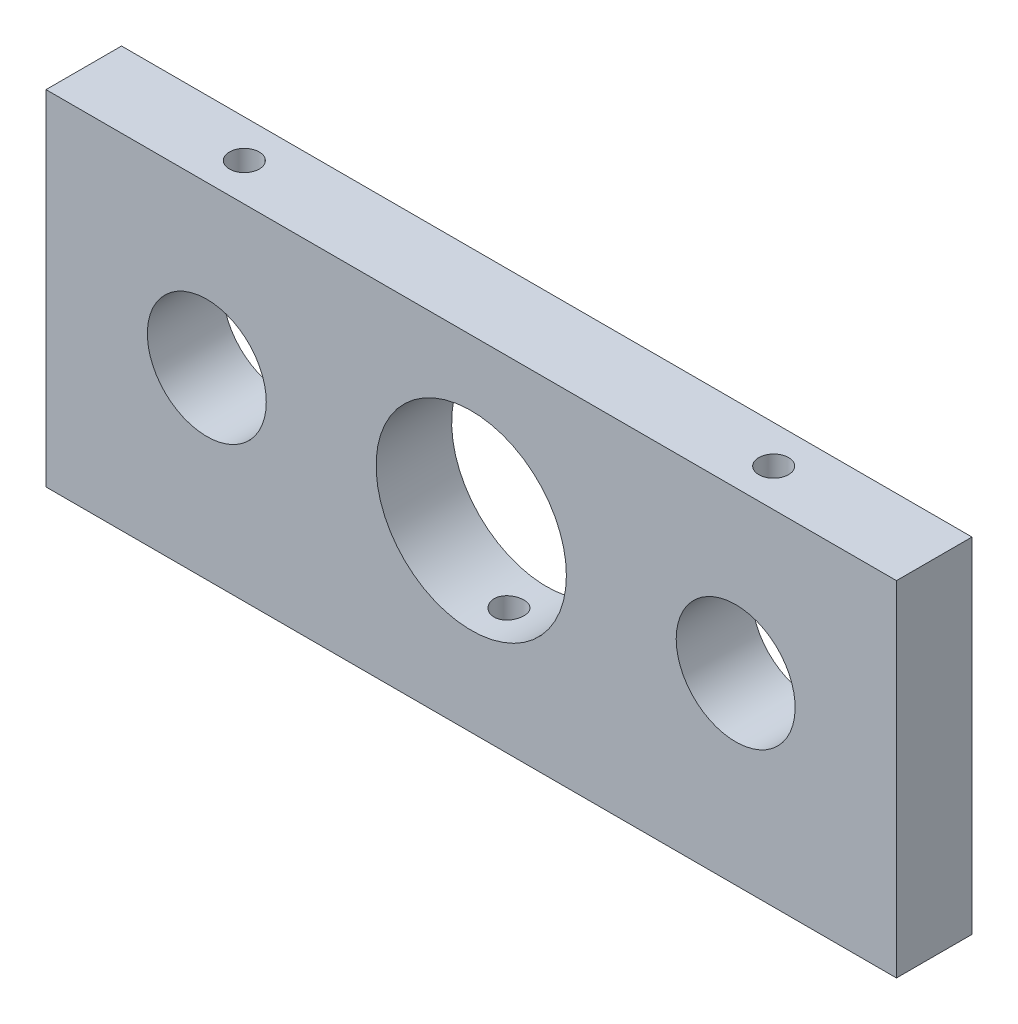
ISO-10303-21;
HEADER;
FILE_DESCRIPTION(('STEP AP214'),'2;1');
FILE_NAME('part.step','',(''),(''),'','','');
FILE_SCHEMA(('AUTOMOTIVE_DESIGN { 1 0 10303 214 1 1 1 1 }'));
ENDSEC;
DATA;
#1=APPLICATION_CONTEXT('core data for automotive mechanical design processes');
#2=APPLICATION_PROTOCOL_DEFINITION('international standard','automotive_design',2000,#1);
#3=PRODUCT_CONTEXT('',#1,'mechanical');
#4=PRODUCT('Part','Part','',(#3));
#5=PRODUCT_RELATED_PRODUCT_CATEGORY('part','',(#4));
#6=PRODUCT_DEFINITION_FORMATION('','',#4);
#7=PRODUCT_DEFINITION_CONTEXT('part definition',#1,'design');
#8=PRODUCT_DEFINITION('design','',#6,#7);
#9=PRODUCT_DEFINITION_SHAPE('','',#8);
#10=(LENGTH_UNIT() NAMED_UNIT(*) SI_UNIT(.MILLI.,.METRE.));
#11=(NAMED_UNIT(*) PLANE_ANGLE_UNIT() SI_UNIT($,.RADIAN.));
#12=(NAMED_UNIT(*) SI_UNIT($,.STERADIAN.) SOLID_ANGLE_UNIT());
#13=UNCERTAINTY_MEASURE_WITH_UNIT(LENGTH_MEASURE(1.E-05),#10,'distance_accuracy_value','');
#14=(GEOMETRIC_REPRESENTATION_CONTEXT(3) GLOBAL_UNCERTAINTY_ASSIGNED_CONTEXT((#13)) GLOBAL_UNIT_ASSIGNED_CONTEXT((#10,
#11,#12)) REPRESENTATION_CONTEXT('',''));
#15=CARTESIAN_POINT('',(0.,0.,0.));
#16=DIRECTION('',(0.,0.,1.));
#17=DIRECTION('',(1.,0.,0.));
#18=AXIS2_PLACEMENT_3D('',#15,#16,#17);
#19=CARTESIAN_POINT('',(-71.505,27.,10.));
#20=DIRECTION('',(1.,0.,0.));
#21=DIRECTION('',(0.,0.,-1.));
#22=AXIS2_PLACEMENT_3D('',#19,#20,#21);
#23=PLANE('',#22);
#24=DIRECTION('',(0.,0.,-1.));
#25=VECTOR('',#24,1.);
#26=CARTESIAN_POINT('',(-71.505,27.,10.));
#27=LINE('',#26,#25);
#28=CARTESIAN_POINT('',(-71.505,27.,10.));
#29=VERTEX_POINT('',#28);
#30=CARTESIAN_POINT('',(-71.505,27.,-2.7));
#31=VERTEX_POINT('',#30);
#32=EDGE_CURVE('E42',#29,#31,#27,.T.);
#33=ORIENTED_EDGE('',*,*,#32,.T.);
#34=DIRECTION('',(0.,-1.,0.));
#35=VECTOR('',#34,1.);
#36=CARTESIAN_POINT('',(-71.505,27.,-2.7));
#37=LINE('',#36,#35);
#38=CARTESIAN_POINT('',(-71.505,-30.87,-2.69999999999999));
#39=VERTEX_POINT('',#38);
#40=EDGE_CURVE('E84',#31,#39,#37,.T.);
#41=ORIENTED_EDGE('',*,*,#40,.T.);
#42=DIRECTION('',(0.,0.,1.));
#43=VECTOR('',#42,1.);
#44=CARTESIAN_POINT('',(-71.505,-30.87,0.));
#45=LINE('',#44,#43);
#46=CARTESIAN_POINT('',(-71.505,-30.87,10.));
#47=VERTEX_POINT('',#46);
#48=EDGE_CURVE('E82',#39,#47,#45,.T.);
#49=ORIENTED_EDGE('',*,*,#48,.T.);
#50=DIRECTION('',(0.,-1.,0.));
#51=VECTOR('',#50,1.);
#52=CARTESIAN_POINT('',(-71.505,27.,10.));
#53=LINE('',#52,#51);
#54=EDGE_CURVE('E72',#29,#47,#53,.T.);
#55=ORIENTED_EDGE('',*,*,#54,.F.);
#56=EDGE_LOOP('',(#33,#41,#49,#55));
#57=FACE_BOUND('',#56,.T.);
#58=ADVANCED_FACE('F30',(#57),#23,.F.);
#59=CARTESIAN_POINT('',(71.505,27.,10.));
#60=DIRECTION('',(-1.,0.,0.));
#61=DIRECTION('',(0.,0.,1.));
#62=AXIS2_PLACEMENT_3D('',#59,#60,#61);
#63=PLANE('',#62);
#64=DIRECTION('',(0.,1.,0.));
#65=VECTOR('',#64,1.);
#66=CARTESIAN_POINT('',(71.505,27.,10.));
#67=LINE('',#66,#65);
#68=CARTESIAN_POINT('',(71.505,-30.87,10.));
#69=VERTEX_POINT('',#68);
#70=CARTESIAN_POINT('',(71.505,27.,10.));
#71=VERTEX_POINT('',#70);
#72=EDGE_CURVE('E55',#69,#71,#67,.T.);
#73=ORIENTED_EDGE('',*,*,#72,.F.);
#74=DIRECTION('',(0.,0.,-1.));
#75=VECTOR('',#74,1.);
#76=CARTESIAN_POINT('',(71.505,-30.87,0.));
#77=LINE('',#76,#75);
#78=CARTESIAN_POINT('',(71.505,-30.87,-2.69999999999999));
#79=VERTEX_POINT('',#78);
#80=EDGE_CURVE('E78',#69,#79,#77,.T.);
#81=ORIENTED_EDGE('',*,*,#80,.T.);
#82=DIRECTION('',(0.,1.,0.));
#83=VECTOR('',#82,1.);
#84=CARTESIAN_POINT('',(71.505,27.,-2.7));
#85=LINE('',#84,#83);
#86=CARTESIAN_POINT('',(71.505,27.,-2.7));
#87=VERTEX_POINT('',#86);
#88=EDGE_CURVE('E110',#79,#87,#85,.T.);
#89=ORIENTED_EDGE('',*,*,#88,.T.);
#90=DIRECTION('',(0.,0.,-1.));
#91=VECTOR('',#90,1.);
#92=CARTESIAN_POINT('',(71.505,27.,10.));
#93=LINE('',#92,#91);
#94=EDGE_CURVE('E11',#71,#87,#93,.T.);
#95=ORIENTED_EDGE('',*,*,#94,.F.);
#96=EDGE_LOOP('',(#73,#81,#89,#95));
#97=FACE_BOUND('',#96,.T.);
#98=ADVANCED_FACE('F143',(#97),#63,.F.);
#99=CARTESIAN_POINT('',(-71.505,27.,10.));
#100=DIRECTION('',(0.,-1.,0.));
#101=DIRECTION('',(0.,0.,-1.));
#102=AXIS2_PLACEMENT_3D('',#99,#100,#101);
#103=PLANE('',#102);
#104=CARTESIAN_POINT('',(44.505,27.,3.65));
#105=DIRECTION('',(0.,1.,0.));
#106=DIRECTION('',(0.,0.,1.));
#107=AXIS2_PLACEMENT_3D('',#104,#105,#106);
#108=CIRCLE('',#107,2.5);
#109=CARTESIAN_POINT('',(44.505,27.,6.15000000000001));
#110=VERTEX_POINT('',#109);
#111=EDGE_CURVE('E342',#110,#110,#108,.T.);
#112=ORIENTED_EDGE('',*,*,#111,.F.);
#113=EDGE_LOOP('',(#112));
#114=FACE_BOUND('',#113,.T.);
#115=CARTESIAN_POINT('',(-44.505,27.,3.65000000000001));
#116=DIRECTION('',(0.,1.,0.));
#117=DIRECTION('',(0.,0.,1.));
#118=AXIS2_PLACEMENT_3D('',#115,#116,#117);
#119=CIRCLE('',#118,2.5);
#120=CARTESIAN_POINT('',(-44.505,27.,6.15000000000002));
#121=VERTEX_POINT('',#120);
#122=EDGE_CURVE('E349',#121,#121,#119,.T.);
#123=ORIENTED_EDGE('',*,*,#122,.F.);
#124=EDGE_LOOP('',(#123));
#125=FACE_BOUND('',#124,.T.);
#126=ORIENTED_EDGE('',*,*,#94,.T.);
#127=DIRECTION('',(-1.,0.,0.));
#128=VECTOR('',#127,1.);
#129=CARTESIAN_POINT('',(129.437951763224,27.,-2.7));
#130=LINE('',#129,#128);
#131=EDGE_CURVE('E87',#87,#31,#130,.T.);
#132=ORIENTED_EDGE('',*,*,#131,.T.);
#133=ORIENTED_EDGE('',*,*,#32,.F.);
#134=DIRECTION('',(-1.,0.,0.));
#135=VECTOR('',#134,1.);
#136=CARTESIAN_POINT('',(-71.505,27.,10.));
#137=LINE('',#136,#135);
#138=EDGE_CURVE('E50',#71,#29,#137,.T.);
#139=ORIENTED_EDGE('',*,*,#138,.F.);
#140=EDGE_LOOP('',(#126,#132,#133,#139));
#141=FACE_BOUND('',#140,.T.);
#142=ADVANCED_FACE('F145',(#114,#125,#141),#103,.F.);
#143=CARTESIAN_POINT('',(-71.505,-27.,10.));
#144=DIRECTION('',(0.,0.,1.));
#145=DIRECTION('',(1.,0.,0.));
#146=AXIS2_PLACEMENT_3D('',#143,#144,#145);
#147=PLANE('',#146);
#148=CARTESIAN_POINT('',(44.4650000000001,4.54497550705923E-13,10.));
#149=DIRECTION('',(0.,0.,1.));
#150=DIRECTION('',(-1.,0.,0.));
#151=AXIS2_PLACEMENT_3D('',#148,#149,#150);
#152=CIRCLE('',#151,9.99999999999993);
#153=CARTESIAN_POINT('',(34.4650000000002,4.54497550705923E-13,10.));
#154=VERTEX_POINT('',#153);
#155=EDGE_CURVE('E91',#154,#154,#152,.T.);
#156=ORIENTED_EDGE('',*,*,#155,.F.);
#157=EDGE_LOOP('',(#156));
#158=FACE_BOUND('',#157,.T.);
#159=CARTESIAN_POINT('',(-44.4650000000001,4.54497550705923E-13,10.));
#160=DIRECTION('',(0.,0.,1.));
#161=DIRECTION('',(1.,0.,0.));
#162=AXIS2_PLACEMENT_3D('',#159,#160,#161);
#163=CIRCLE('',#162,9.99999999999993);
#164=CARTESIAN_POINT('',(-34.4650000000002,4.54497550705923E-13,10.));
#165=VERTEX_POINT('',#164);
#166=EDGE_CURVE('E102',#165,#165,#163,.T.);
#167=ORIENTED_EDGE('',*,*,#166,.F.);
#168=EDGE_LOOP('',(#167));
#169=FACE_BOUND('',#168,.T.);
#170=CARTESIAN_POINT('',(0.,0.,10.));
#171=DIRECTION('',(0.,0.,1.));
#172=DIRECTION('',(1.,0.,0.));
#173=AXIS2_PLACEMENT_3D('',#170,#171,#172);
#174=CIRCLE('',#173,16.);
#175=CARTESIAN_POINT('',(16.,0.,10.));
#176=VERTEX_POINT('',#175);
#177=EDGE_CURVE('E106',#176,#176,#174,.T.);
#178=ORIENTED_EDGE('',*,*,#177,.F.);
#179=EDGE_LOOP('',(#178));
#180=FACE_BOUND('',#179,.T.);
#181=ORIENTED_EDGE('',*,*,#54,.T.);
#182=DIRECTION('',(1.,0.,0.));
#183=VECTOR('',#182,1.);
#184=CARTESIAN_POINT('',(-71.505,-30.87,10.));
#185=LINE('',#184,#183);
#186=EDGE_CURVE('E76',#47,#69,#185,.T.);
#187=ORIENTED_EDGE('',*,*,#186,.T.);
#188=ORIENTED_EDGE('',*,*,#72,.T.);
#189=ORIENTED_EDGE('',*,*,#138,.T.);
#190=EDGE_LOOP('',(#181,#187,#188,#189));
#191=FACE_BOUND('',#190,.T.);
#192=ADVANCED_FACE('F74',(#158,#169,#180,#191),#147,.T.);
#193=CARTESIAN_POINT('',(129.437951763224,-30.87,0.));
#194=DIRECTION('',(0.,-1.,0.));
#195=DIRECTION('',(0.,0.,-1.));
#196=AXIS2_PLACEMENT_3D('',#193,#194,#195);
#197=PLANE('',#196);
#198=CARTESIAN_POINT('',(33.505,-30.87,3.65000000000001));
#199=DIRECTION('',(0.,-1.,0.));
#200=DIRECTION('',(0.,0.,1.));
#201=AXIS2_PLACEMENT_3D('',#198,#199,#200);
#202=CIRCLE('',#201,2.5);
#203=CARTESIAN_POINT('',(33.505,-30.87,6.15000000000001));
#204=VERTEX_POINT('',#203);
#205=EDGE_CURVE('E355',#204,#204,#202,.T.);
#206=ORIENTED_EDGE('',*,*,#205,.F.);
#207=EDGE_LOOP('',(#206));
#208=FACE_BOUND('',#207,.T.);
#209=CARTESIAN_POINT('',(61.505,-30.87,3.65000000000002));
#210=DIRECTION('',(0.,-1.,0.));
#211=DIRECTION('',(0.,0.,1.));
#212=AXIS2_PLACEMENT_3D('',#209,#210,#211);
#213=CIRCLE('',#212,2.5);
#214=CARTESIAN_POINT('',(61.505,-30.87,6.15000000000002));
#215=VERTEX_POINT('',#214);
#216=EDGE_CURVE('E359',#215,#215,#213,.T.);
#217=ORIENTED_EDGE('',*,*,#216,.F.);
#218=EDGE_LOOP('',(#217));
#219=FACE_BOUND('',#218,.T.);
#220=CARTESIAN_POINT('',(-33.505,-30.87,3.65));
#221=DIRECTION('',(0.,-1.,0.));
#222=DIRECTION('',(0.,0.,-1.));
#223=AXIS2_PLACEMENT_3D('',#220,#221,#222);
#224=CIRCLE('',#223,2.5);
#225=CARTESIAN_POINT('',(-33.505,-30.87,1.15));
#226=VERTEX_POINT('',#225);
#227=EDGE_CURVE('E365',#226,#226,#224,.T.);
#228=ORIENTED_EDGE('',*,*,#227,.F.);
#229=EDGE_LOOP('',(#228));
#230=FACE_BOUND('',#229,.T.);
#231=CARTESIAN_POINT('',(0.,-30.87,3.65));
#232=DIRECTION('',(0.,-1.,0.));
#233=DIRECTION('',(0.,0.,-1.));
#234=AXIS2_PLACEMENT_3D('',#231,#232,#233);
#235=CIRCLE('',#234,2.5);
#236=CARTESIAN_POINT('',(0.,-30.87,1.15));
#237=VERTEX_POINT('',#236);
#238=EDGE_CURVE('E371',#237,#237,#235,.T.);
#239=ORIENTED_EDGE('',*,*,#238,.F.);
#240=EDGE_LOOP('',(#239));
#241=FACE_BOUND('',#240,.T.);
#242=CARTESIAN_POINT('',(-61.505,-30.87,3.65));
#243=DIRECTION('',(0.,-1.,0.));
#244=DIRECTION('',(0.,0.,-1.));
#245=AXIS2_PLACEMENT_3D('',#242,#243,#244);
#246=CIRCLE('',#245,2.5);
#247=CARTESIAN_POINT('',(-61.505,-30.87,1.15));
#248=VERTEX_POINT('',#247);
#249=EDGE_CURVE('E98',#248,#248,#246,.T.);
#250=ORIENTED_EDGE('',*,*,#249,.F.);
#251=EDGE_LOOP('',(#250));
#252=FACE_BOUND('',#251,.T.);
#253=ORIENTED_EDGE('',*,*,#80,.F.);
#254=ORIENTED_EDGE('',*,*,#186,.F.);
#255=ORIENTED_EDGE('',*,*,#48,.F.);
#256=DIRECTION('',(-1.,0.,0.));
#257=VECTOR('',#256,1.);
#258=CARTESIAN_POINT('',(129.437951763224,-30.87,-2.69999999999999));
#259=LINE('',#258,#257);
#260=EDGE_CURVE('E113',#79,#39,#259,.T.);
#261=ORIENTED_EDGE('',*,*,#260,.F.);
#262=EDGE_LOOP('',(#253,#254,#255,#261));
#263=FACE_BOUND('',#262,.T.);
#264=ADVANCED_FACE('F90',(#208,#219,#230,#241,#252,#263),#197,.T.);
#265=CARTESIAN_POINT('',(129.437951763224,27.,-2.7));
#266=DIRECTION('',(0.,0.,-1.));
#267=DIRECTION('',(0.,1.,0.));
#268=AXIS2_PLACEMENT_3D('',#265,#266,#267);
#269=PLANE('',#268);
#270=CARTESIAN_POINT('',(44.4650000000001,4.54497550705923E-13,-2.7));
#271=DIRECTION('',(0.,0.,-1.));
#272=DIRECTION('',(0.,1.,0.));
#273=AXIS2_PLACEMENT_3D('',#270,#271,#272);
#274=CIRCLE('',#273,9.99999999999993);
#275=CARTESIAN_POINT('',(44.4650000000001,10.0000000000004,-2.7));
#276=VERTEX_POINT('',#275);
#277=EDGE_CURVE('E95',#276,#276,#274,.T.);
#278=ORIENTED_EDGE('',*,*,#277,.F.);
#279=EDGE_LOOP('',(#278));
#280=FACE_BOUND('',#279,.T.);
#281=CARTESIAN_POINT('',(-44.4650000000001,4.54497550705923E-13,-2.7));
#282=DIRECTION('',(0.,0.,-1.));
#283=DIRECTION('',(0.,1.,0.));
#284=AXIS2_PLACEMENT_3D('',#281,#282,#283);
#285=CIRCLE('',#284,9.99999999999993);
#286=CARTESIAN_POINT('',(-44.4650000000001,10.0000000000004,-2.7));
#287=VERTEX_POINT('',#286);
#288=EDGE_CURVE('E105',#287,#287,#285,.T.);
#289=ORIENTED_EDGE('',*,*,#288,.F.);
#290=EDGE_LOOP('',(#289));
#291=FACE_BOUND('',#290,.T.);
#292=CARTESIAN_POINT('',(0.,0.,-2.7));
#293=DIRECTION('',(0.,0.,-1.));
#294=DIRECTION('',(0.,1.,0.));
#295=AXIS2_PLACEMENT_3D('',#292,#293,#294);
#296=CIRCLE('',#295,16.);
#297=CARTESIAN_POINT('',(0.,16.,-2.7));
#298=VERTEX_POINT('',#297);
#299=EDGE_CURVE('E109',#298,#298,#296,.T.);
#300=ORIENTED_EDGE('',*,*,#299,.F.);
#301=EDGE_LOOP('',(#300));
#302=FACE_BOUND('',#301,.T.);
#303=ORIENTED_EDGE('',*,*,#88,.F.);
#304=ORIENTED_EDGE('',*,*,#260,.T.);
#305=ORIENTED_EDGE('',*,*,#40,.F.);
#306=ORIENTED_EDGE('',*,*,#131,.F.);
#307=EDGE_LOOP('',(#303,#304,#305,#306));
#308=FACE_BOUND('',#307,.T.);
#309=ADVANCED_FACE('F131',(#280,#291,#302,#308),#269,.T.);
#310=CARTESIAN_POINT('',(0.,0.,-9.));
#311=DIRECTION('',(0.,0.,1.));
#312=DIRECTION('',(1.,0.,0.));
#313=AXIS2_PLACEMENT_3D('',#310,#311,#312);
#314=CYLINDRICAL_SURFACE('',#313,16.);
#315=CARTESIAN_POINT('',(0.,-16.,1.15));
#316=CARTESIAN_POINT('',(0.139515097271033,-15.9999977019448,1.15000569827152));
#317=CARTESIAN_POINT('',(0.279109404865704,-15.9981561248574,1.16171811377356));
#318=CARTESIAN_POINT('',(0.554391314978102,-15.9909869809759,1.20824369127676));
#319=CARTESIAN_POINT('',(0.690075061323317,-15.9856560884472,1.24307889250351));
#320=CARTESIAN_POINT('',(0.953512538047403,-15.9721069716578,1.33477966280662));
#321=CARTESIAN_POINT('',(1.0812723522899,-15.9638909956317,1.39162808136161));
#322=CARTESIAN_POINT('',(1.3254212510446,-15.9454779403815,1.52569854514161));
#323=CARTESIAN_POINT('',(1.44181181036831,-15.9352811186255,1.60291794303595));
#324=CARTESIAN_POINT('',(1.66091991165162,-15.9139426841436,1.77623304835396));
#325=CARTESIAN_POINT('',(1.76352747914264,-15.9027945139234,1.87246699489025));
#326=CARTESIAN_POINT('',(1.95120768822823,-15.8808607613029,2.08078194826889));
#327=CARTESIAN_POINT('',(2.03627928654192,-15.8700752005075,2.1928638973002));
#328=CARTESIAN_POINT('',(2.18690544328884,-15.8500242812745,2.43043827134373));
#329=CARTESIAN_POINT('',(2.25235273557991,-15.840767397861,2.5559994823618));
#330=CARTESIAN_POINT('',(2.36118681597065,-15.8249120174236,2.81650141085781));
#331=CARTESIAN_POINT('',(2.40457491010063,-15.8183133630222,2.95144157251056));
#332=CARTESIAN_POINT('',(2.46771559322167,-15.8085863451104,3.22571090114379));
#333=CARTESIAN_POINT('',(2.48765705487496,-15.8054302653236,3.3649955858188));
#334=CARTESIAN_POINT('',(2.50392369757621,-15.8028617107177,3.64496718889265));
#335=CARTESIAN_POINT('',(2.50025034860466,-15.8034490028802,3.78565401946604));
#336=CARTESIAN_POINT('',(2.4695458080889,-15.8082755045521,4.06309703185269));
#337=CARTESIAN_POINT('',(2.44272562959693,-15.8124817218495,4.19987722335315));
#338=CARTESIAN_POINT('',(2.36681937833752,-15.8240205634547,4.46697200635933));
#339=CARTESIAN_POINT('',(2.31773262684132,-15.8313532830641,4.59728640064054));
#340=CARTESIAN_POINT('',(2.19846916949384,-15.8483550685462,4.84838871267716));
#341=CARTESIAN_POINT('',(2.12820372315549,-15.8580339308724,4.96913379177307));
#342=CARTESIAN_POINT('',(1.96864058146637,-15.878630461501,5.19719953568554));
#343=CARTESIAN_POINT('',(1.87934153253016,-15.8895482178821,5.30451924488747));
#344=CARTESIAN_POINT('',(1.68309088822333,-15.911537862489,5.50391024663332));
#345=CARTESIAN_POINT('',(1.57595800560539,-15.9226101363559,5.59580315826946));
#346=CARTESIAN_POINT('',(1.34769694737936,-15.9435512534783,5.7603331456399));
#347=CARTESIAN_POINT('',(1.22656870068132,-15.9534200906202,5.83297012355683));
#348=CARTESIAN_POINT('',(0.973595927056491,-15.9708539902704,5.9569380734224));
#349=CARTESIAN_POINT('',(0.841744186240461,-15.9784174854193,6.008254558533));
#350=CARTESIAN_POINT('',(0.571149534696759,-15.9903756000068,6.08796596744723));
#351=CARTESIAN_POINT('',(0.4324071306872,-15.9947704520898,6.11636257406648));
#352=CARTESIAN_POINT('',(0.153508336763735,-15.9998651172728,6.14918927645019));
#353=CARTESIAN_POINT('',(0.0133814615087016,-16.0006027179286,6.15386447897619));
#354=CARTESIAN_POINT('',(-0.265654546411642,-15.9984028649127,6.13976729466403));
#355=CARTESIAN_POINT('',(-0.404563719925156,-15.9954655349964,6.1209956974109));
#356=CARTESIAN_POINT('',(-0.676473446265705,-15.9862692369322,6.06074161231983));
#357=CARTESIAN_POINT('',(-0.809501262056042,-15.9800278421539,6.01937924173227));
#358=CARTESIAN_POINT('',(-1.06673406785663,-15.9649207568356,5.91524490560121));
#359=CARTESIAN_POINT('',(-1.19093861303941,-15.9560549341007,5.85247186155733));
#360=CARTESIAN_POINT('',(-1.42807220225041,-15.9365897274094,5.70672800887343));
#361=CARTESIAN_POINT('',(-1.54090512378372,-15.9259772866342,5.62360257990953));
#362=CARTESIAN_POINT('',(-1.75110696507806,-15.9042388046444,5.43972791409221));
#363=CARTESIAN_POINT('',(-1.84847490447018,-15.8931127309268,5.33897756079515));
#364=CARTESIAN_POINT('',(-2.02588080776691,-15.8714802753665,5.12161880278279));
#365=CARTESIAN_POINT('',(-2.10575398584126,-15.860980411908,5.00487515287767));
#366=CARTESIAN_POINT('',(-2.2447556772664,-15.8419069280583,4.75948392633867));
#367=CARTESIAN_POINT('',(-2.30388478778105,-15.83333325222,4.63083669251053));
#368=CARTESIAN_POINT('',(-2.39946771944995,-15.8191307135236,4.36577035928581));
#369=CARTESIAN_POINT('',(-2.43600654947912,-15.8134908234896,4.22938253123438));
#370=CARTESIAN_POINT('',(-2.48564122040535,-15.8057657028079,3.95231085633602));
#371=CARTESIAN_POINT('',(-2.49873883084997,-15.8036802038444,3.811627334581));
#372=CARTESIAN_POINT('',(-2.50107452690756,-15.8033105804488,3.53160128409253));
#373=CARTESIAN_POINT('',(-2.49057180548425,-15.804985160429,3.3922609030665));
#374=CARTESIAN_POINT('',(-2.44656223255901,-15.8118569894183,3.11735470285572));
#375=CARTESIAN_POINT('',(-2.41305543086961,-15.8170542307995,2.98178887549829));
#376=CARTESIAN_POINT('',(-2.32408329891852,-15.8303708885491,2.71836217335948));
#377=CARTESIAN_POINT('',(-2.26863761738581,-15.8384876895341,2.59049452174159));
#378=CARTESIAN_POINT('',(-2.13738768546417,-15.856731840474,2.34583438632373));
#379=CARTESIAN_POINT('',(-2.06158262820886,-15.8668592701083,2.22904234171157));
#380=CARTESIAN_POINT('',(-1.8908300813908,-15.8881156809226,2.00853445587317));
#381=CARTESIAN_POINT('',(-1.79569107094768,-15.8992540116029,1.90496780338617));
#382=CARTESIAN_POINT('',(-1.58937594638204,-15.9212004364073,1.71517876361327));
#383=CARTESIAN_POINT('',(-1.47819612078432,-15.9320084534012,1.62896040140813));
#384=CARTESIAN_POINT('',(-1.24216685884341,-15.952151024567,1.47584877696844));
#385=CARTESIAN_POINT('',(-1.11723937214238,-15.9614763443027,1.40907462724039));
#386=CARTESIAN_POINT('',(-0.857851882357782,-15.9775125983888,1.29755900380706));
#387=CARTESIAN_POINT('',(-0.723401776581761,-15.9842262014212,1.25279502744161));
#388=CARTESIAN_POINT('',(-0.490314239911593,-15.9927744586488,1.19656697890942));
#389=CARTESIAN_POINT('',(-0.393105575651624,-15.9954699162612,1.179131509371));
#390=CARTESIAN_POINT('',(-0.197277797850581,-15.9990834869762,1.15584608662093));
#391=CARTESIAN_POINT('',(-0.0986587041691182,-16.0000016250796,1.14999597044267));
#392=CARTESIAN_POINT('',(0.,-16.,1.15));
#393=B_SPLINE_CURVE_WITH_KNOTS('',3,(#315,#316,#317,#318,#319,#320,#321,#322,#323,#324,#325,
#326,#327,#328,#329,#330,#331,#332,#333,#334,#335,#336,#337,#338,#339,#340,#341,#342,#343,#344,
#345,#346,#347,#348,#349,#350,#351,#352,#353,#354,#355,#356,#357,#358,#359,#360,#361,#362,#363,
#364,#365,#366,#367,#368,#369,#370,#371,#372,#373,#374,#375,#376,#377,#378,#379,#380,#381,#382,
#383,#384,#385,#386,#387,#388,#389,#390,#391,#392),.UNSPECIFIED.,.T.,.F.,(4,2,2,2,2,2,2,2,2,2,2,
2,2,2,2,2,2,2,2,2,2,2,2,2,2,2,2,2,2,2,2,2,2,2,2,2,2,2,4),(0.,0.41818474047749,0.836768642528014,
1.25502707944103,1.6732311879203,2.09459568152199,2.51598523645422,2.93963778605759,
3.36326525009238,3.78345631134994,4.20362121670545,4.6199957602258,5.0363829965105,
5.45453977402347,5.87272629892068,6.29545732334367,6.71819049513827,7.14121043754564,
7.56419931829866,7.98280854005914,8.40140366528356,8.81779444756567,9.23420620742031,
9.65388541469671,10.0735912160142,10.4970948024959,10.9205861964898,11.3424741039513,
11.764330162293,12.1815758159869,12.598820566189,13.0156924696662,13.4325808967135,
13.8538201231554,14.275156971423,14.6990230419984,15.1224548565628,15.4181801635154,
15.7139013105871),.UNSPECIFIED.);
#394=CARTESIAN_POINT('',(0.,-16.,1.15));
#395=VERTEX_POINT('',#394);
#396=EDGE_CURVE('E33',#395,#395,#393,.T.);
#397=ORIENTED_EDGE('',*,*,#396,.T.);
#398=EDGE_LOOP('',(#397));
#399=FACE_BOUND('',#398,.T.);
#400=ORIENTED_EDGE('',*,*,#299,.T.);
#401=EDGE_LOOP('',(#400));
#402=FACE_BOUND('',#401,.T.);
#403=ORIENTED_EDGE('',*,*,#177,.T.);
#404=EDGE_LOOP('',(#403));
#405=FACE_BOUND('',#404,.T.);
#406=ADVANCED_FACE('F134',(#399,#402,#405),#314,.F.);
#407=CARTESIAN_POINT('',(-44.4650000000001,4.54497550705923E-13,-9.));
#408=DIRECTION('',(0.,0.,1.));
#409=DIRECTION('',(1.,0.,0.));
#410=AXIS2_PLACEMENT_3D('',#407,#408,#409);
#411=CYLINDRICAL_SURFACE('',#410,9.99999999999993);
#412=CARTESIAN_POINT('',(-44.505,9.99991999968038,6.15000000000002));
#413=CARTESIAN_POINT('',(-44.6432099811864,9.99936478689109,6.14999607994239));
#414=CARTESIAN_POINT('',(-44.7814522339321,9.99592021860336,6.13850016588834));
#415=CARTESIAN_POINT('',(-45.0539509669452,9.98357539781593,6.09290020098508));
#416=CARTESIAN_POINT('',(-45.188205098613,9.97467199487196,6.05878309389397));
#417=CARTESIAN_POINT('',(-45.4487543017859,9.95235210825709,5.96911317597726));
#418=CARTESIAN_POINT('',(-45.5750589309147,9.93894117196275,5.91358670114669));
#419=CARTESIAN_POINT('',(-45.8165522862297,9.90899247912154,5.78276724398533));
#420=CARTESIAN_POINT('',(-45.9317406443809,9.89245461910279,5.70747360751462));
#421=CARTESIAN_POINT('',(-46.1501539333897,9.85762298641188,5.53758283818137));
#422=CARTESIAN_POINT('',(-46.2531119255074,9.83930195641963,5.44264808413058));
#423=CARTESIAN_POINT('',(-46.4418183026853,9.80313425669843,5.23689170909711));
#424=CARTESIAN_POINT('',(-46.5275647426892,9.78528764077993,5.1260682949798));
#425=CARTESIAN_POINT('',(-46.6806134499443,9.75178463824115,4.88968276818492));
#426=CARTESIAN_POINT('',(-46.7476293425659,9.73616387940855,4.76392974647542));
#427=CARTESIAN_POINT('',(-46.8594611303766,9.7092680965928,4.50247793925686));
#428=CARTESIAN_POINT('',(-46.904280746732,9.69799234424742,4.36678082523918));
#429=CARTESIAN_POINT('',(-46.9695157191554,9.68134914459555,4.09231060369477));
#430=CARTESIAN_POINT('',(-46.9904241812854,9.67586250329877,3.95366208336153));
#431=CARTESIAN_POINT('',(-47.0087803490029,9.67105367028337,3.67472512282709));
#432=CARTESIAN_POINT('',(-47.0062319744678,9.671730448594,3.53443696054006));
#433=CARTESIAN_POINT('',(-46.978134021518,9.67906760192449,3.25990040343334));
#434=CARTESIAN_POINT('',(-46.9531588828053,9.68557853203056,3.12558860378029));
#435=CARTESIAN_POINT('',(-46.881831585987,9.70362125903614,2.86312692034619));
#436=CARTESIAN_POINT('',(-46.8354778789307,9.7151534197377,2.73497748379259));
#437=CARTESIAN_POINT('',(-46.7222186521775,9.74209265478422,2.48693245078823));
#438=CARTESIAN_POINT('',(-46.6551041244052,9.75753883340111,2.36713671262238));
#439=CARTESIAN_POINT('',(-46.5023782941445,9.79056573970764,2.14030360308365));
#440=CARTESIAN_POINT('',(-46.4167636768148,9.8081468496861,2.03326852350243));
#441=CARTESIAN_POINT('',(-46.2264802709273,9.84412594675495,1.83168353012069));
#442=CARTESIAN_POINT('',(-46.1213244225425,9.86253274010726,1.73759436190941));
#443=CARTESIAN_POINT('',(-45.89651491466,9.89766078702072,1.56829716164673));
#444=CARTESIAN_POINT('',(-45.7768607313274,9.91438197963992,1.49308981211031));
#445=CARTESIAN_POINT('',(-45.5257133853551,9.94439170258071,1.36347635598142));
#446=CARTESIAN_POINT('',(-45.3941731171813,9.95766568800726,1.30915793798988));
#447=CARTESIAN_POINT('',(-45.1234183207935,9.97922357384894,1.22354009342425));
#448=CARTESIAN_POINT('',(-44.9842052716285,9.98750843234987,1.1922362469972));
#449=CARTESIAN_POINT('',(-44.7058954763283,9.99804284692143,1.15423205778333));
#450=CARTESIAN_POINT('',(-44.5668879126632,10.0004422154903,1.14691935406673));
#451=CARTESIAN_POINT('',(-44.2896143567662,9.99942273616646,1.15543735660199));
#452=CARTESIAN_POINT('',(-44.1513482954229,9.9960044403052,1.17126586699073));
#453=CARTESIAN_POINT('',(-43.8817187188233,9.98387331673059,1.22510216870381));
#454=CARTESIAN_POINT('',(-43.7502811072789,9.97524405139274,1.26275954114698));
#455=CARTESIAN_POINT('',(-43.4955858203592,9.95372219877769,1.35879686039134));
#456=CARTESIAN_POINT('',(-43.3723289392644,9.94082919825237,1.41717881589301));
#457=CARTESIAN_POINT('',(-43.1351731695114,9.9119164186869,1.55413666429028));
#458=CARTESIAN_POINT('',(-43.0214689126848,9.89584722542749,1.63303888055832));
#459=CARTESIAN_POINT('',(-42.8086949122337,9.86246787728034,1.80838082330229));
#460=CARTESIAN_POINT('',(-42.7096276650955,9.84515751144448,1.90482353523899));
#461=CARTESIAN_POINT('',(-42.5264455721752,9.81075536509614,2.1153155026957));
#462=CARTESIAN_POINT('',(-42.442755382834,9.79367926897533,2.22973748525543));
#463=CARTESIAN_POINT('',(-42.2957578079777,9.7621750549447,2.47133957644622));
#464=CARTESIAN_POINT('',(-42.2324496097579,9.74774683146433,2.59851917611899));
#465=CARTESIAN_POINT('',(-42.1284375223619,9.72333961683669,2.86144002199609));
#466=CARTESIAN_POINT('',(-42.0876153850927,9.71333740625165,2.99713221796498));
#467=CARTESIAN_POINT('',(-42.029441798756,9.69891597766307,3.27373678857513));
#468=CARTESIAN_POINT('',(-42.0120853845757,9.694495578617,3.41464805242885));
#469=CARTESIAN_POINT('',(-42.0015955709813,9.69183484588967,3.69348942085862));
#470=CARTESIAN_POINT('',(-42.007802023222,9.69342608125027,3.83139346593259));
#471=CARTESIAN_POINT('',(-42.0427506921386,9.70221761165753,4.10412414274052));
#472=CARTESIAN_POINT('',(-42.0714924751145,9.70941779875802,4.23895083364779));
#473=CARTESIAN_POINT('',(-42.150334060125,9.72851169191741,4.50097813654151));
#474=CARTESIAN_POINT('',(-42.200309244189,9.74037798299411,4.62821838120426));
#475=CARTESIAN_POINT('',(-42.3201023340049,9.76745454560774,4.87259869535935));
#476=CARTESIAN_POINT('',(-42.3899229370389,9.78266527163849,4.98973738908084));
#477=CARTESIAN_POINT('',(-42.549509224249,9.81517572033403,5.21379309836881));
#478=CARTESIAN_POINT('',(-42.6397355567753,9.8325186169851,5.3203758082353));
#479=CARTESIAN_POINT('',(-42.8366775949134,9.86704325307798,5.51710408384067));
#480=CARTESIAN_POINT('',(-42.9433971201627,9.88422495420857,5.60724583146858));
#481=CARTESIAN_POINT('',(-43.172511773264,9.91680770977082,5.77003786729999));
#482=CARTESIAN_POINT('',(-43.2951444795571,9.93217314684704,5.84236144071557));
#483=CARTESIAN_POINT('',(-43.5512003951569,9.95899025328934,5.9652539527357));
#484=CARTESIAN_POINT('',(-43.6846157289386,9.97044474778574,6.01583860165305));
#485=CARTESIAN_POINT('',(-43.9323451529865,9.98642352392148,6.08626134409282));
#486=CARTESIAN_POINT('',(-44.0454769075816,9.99185065308547,6.11011345295742));
#487=CARTESIAN_POINT('',(-44.2740650437201,9.99883070026926,6.14198384851948));
#488=CARTESIAN_POINT('',(-44.3895212572741,10.0003838972535,6.15000327533023));
#489=CARTESIAN_POINT('',(-44.505,9.99991999968038,6.15000000000002));
#490=B_SPLINE_CURVE_WITH_KNOTS('',3,(#412,#413,#414,#415,#416,#417,#418,#419,#420,#421,#422,
#423,#424,#425,#426,#427,#428,#429,#430,#431,#432,#433,#434,#435,#436,#437,#438,#439,#440,#441,
#442,#443,#444,#445,#446,#447,#448,#449,#450,#451,#452,#453,#454,#455,#456,#457,#458,#459,#460,
#461,#462,#463,#464,#465,#466,#467,#468,#469,#470,#471,#472,#473,#474,#475,#476,#477,#478,#479,
#480,#481,#482,#483,#484,#485,#486,#487,#488,#489),.UNSPECIFIED.,.T.,.F.,(4,2,2,2,2,2,2,2,2,2,2,
2,2,2,2,2,2,2,2,2,2,2,2,2,2,2,2,2,2,2,2,2,2,2,2,2,2,2,4),(0.,0.41420961157438,0.828658500269935,
1.24259918715868,1.65655357400409,2.07832366925688,2.5001414014258,2.92809374474856,
3.35597431831237,3.77486214127805,4.19367996506981,4.60206687622291,5.01048338106184,
5.42315331518537,5.83589725280233,6.26080145615481,6.68572101617106,7.11240534460485,
7.53900770866361,7.95463290819098,8.37021867172324,8.77931084842276,9.18844268662541,
9.60452749277488,10.0206831845687,10.4470106788195,10.8733211717227,11.297367873176,
11.721324836531,12.1334928384387,12.5456529082306,12.9554267327691,13.3652562782022,
13.7854727251748,14.2057866357741,14.6333134944907,15.0605308658733,15.4066408179167,
15.7527258456332),.UNSPECIFIED.);
#491=CARTESIAN_POINT('',(-44.505,9.99991999968038,6.15000000000002));
#492=VERTEX_POINT('',#491);
#493=EDGE_CURVE('E344',#492,#492,#490,.T.);
#494=ORIENTED_EDGE('',*,*,#493,.F.);
#495=EDGE_LOOP('',(#494));
#496=FACE_BOUND('',#495,.T.);
#497=ORIENTED_EDGE('',*,*,#288,.T.);
#498=EDGE_LOOP('',(#497));
#499=FACE_BOUND('',#498,.T.);
#500=ORIENTED_EDGE('',*,*,#166,.T.);
#501=EDGE_LOOP('',(#500));
#502=FACE_BOUND('',#501,.T.);
#503=ADVANCED_FACE('F193',(#496,#499,#502),#411,.F.);
#504=CARTESIAN_POINT('',(44.4650000000001,4.54497550705923E-13,-9.));
#505=DIRECTION('',(0.,0.,1.));
#506=DIRECTION('',(1.,0.,0.));
#507=AXIS2_PLACEMENT_3D('',#504,#505,#506);
#508=CYLINDRICAL_SURFACE('',#507,9.99999999999993);
#509=CARTESIAN_POINT('',(44.505,9.99991999968038,6.15000000000001));
#510=CARTESIAN_POINT('',(44.3669548259788,10.0004698821922,6.14999616793433));
#511=CARTESIAN_POINT('',(44.2288553490215,9.99813761703188,6.13852773891174));
#512=CARTESIAN_POINT('',(43.9565905995627,9.98799856043951,6.09301468074265));
#513=CARTESIAN_POINT('',(43.8224275580513,9.98018872471273,6.05895749791212));
#514=CARTESIAN_POINT('',(43.5620078908397,9.96000260380931,5.96941853586122));
#515=CARTESIAN_POINT('',(43.4357421929126,9.94763167531582,5.91396188526654));
#516=CARTESIAN_POINT('',(43.1942977860448,9.91968278598122,5.78328615171643));
#517=CARTESIAN_POINT('',(43.0791194582521,9.90410471494661,5.70806638970014));
#518=CARTESIAN_POINT('',(42.8607972663723,9.87111731888736,5.53839972495474));
#519=CARTESIAN_POINT('',(42.7579088526534,9.85367996006676,5.44362956271289));
#520=CARTESIAN_POINT('',(42.569303811996,9.81914198865381,5.23824527874339));
#521=CARTESIAN_POINT('',(42.4835891214644,9.80204141423104,5.12762937275275));
#522=CARTESIAN_POINT('',(42.3305084607022,9.76986062155157,4.89163656004045));
#523=CARTESIAN_POINT('',(42.2634402246532,9.75481494606436,4.7660613707197));
#524=CARTESIAN_POINT('',(42.151459581533,9.72886720759923,4.50499271561034));
#525=CARTESIAN_POINT('',(42.106543799448,9.71796451347987,4.3695007642941));
#526=CARTESIAN_POINT('',(42.0409939314227,9.70182061997871,4.09517433377706));
#527=CARTESIAN_POINT('',(42.0199131572666,9.69647542766135,3.95645285915038));
#528=CARTESIAN_POINT('',(42.0012415369491,9.69174877574556,3.67734725610164));
#529=CARTESIAN_POINT('',(42.0036469715907,9.69236637189982,3.53696339444615));
#530=CARTESIAN_POINT('',(42.0315169764115,9.69939942598095,3.26202082146127));
#531=CARTESIAN_POINT('',(42.0564365369921,9.70567784259421,3.12740280667999));
#532=CARTESIAN_POINT('',(42.1277569908658,9.72309774841159,2.86431897596895));
#533=CARTESIAN_POINT('',(42.174159388899,9.73423957826464,2.73585359168859));
#534=CARTESIAN_POINT('',(42.2875919678089,9.7602405130434,2.48726506723476));
#535=CARTESIAN_POINT('',(42.3548194893774,9.77513491419324,2.36723582334543));
#536=CARTESIAN_POINT('',(42.5078595157849,9.80692064506272,2.13996476243792));
#537=CARTESIAN_POINT('',(42.5936751944895,9.82381231558545,2.03272513405852));
#538=CARTESIAN_POINT('',(42.7842668626398,9.85823255179597,1.83097319775225));
#539=CARTESIAN_POINT('',(42.8895005166428,9.87576583397527,1.73689350205564));
#540=CARTESIAN_POINT('',(43.1144695058541,9.90903511456765,1.56763609080139));
#541=CARTESIAN_POINT('',(43.234205203926,9.92477106798965,1.492458848357));
#542=CARTESIAN_POINT('',(43.4853180980846,9.95269840811383,1.36302581054587));
#543=CARTESIAN_POINT('',(43.6167262053241,9.9648799935213,1.30882773419947));
#544=CARTESIAN_POINT('',(43.8871561250498,9.98420992070335,1.22340448950809));
#545=CARTESIAN_POINT('',(44.0261764818614,9.99135922119351,1.19217494530874));
#546=CARTESIAN_POINT('',(44.3040884620147,9.99964702147563,1.15424320099822));
#547=CARTESIAN_POINT('',(44.4428933959164,10.0009338020091,1.14693726543855));
#548=CARTESIAN_POINT('',(44.7197219191348,9.99771340513766,1.15539242069096));
#549=CARTESIAN_POINT('',(44.8577455739917,9.99320672119403,1.17115154694071));
#550=CARTESIAN_POINT('',(45.1271030269254,9.9789563457725,1.22480177760028));
#551=CARTESIAN_POINT('',(45.2585034581489,9.96928690848738,1.2623797233925));
#552=CARTESIAN_POINT('',(45.5131190161745,9.94574326141432,1.35823075882611));
#553=CARTESIAN_POINT('',(45.6363332816132,9.93186860999766,1.41650602219625));
#554=CARTESIAN_POINT('',(45.8735969871562,9.90103246745663,1.55332596878163));
#555=CARTESIAN_POINT('',(45.9874348287662,9.88401864106304,1.63222553202567));
#556=CARTESIAN_POINT('',(46.2004665526556,9.84884933597288,1.80760053249324));
#557=CARTESIAN_POINT('',(46.2996578677355,9.83069365792931,1.90407904429764));
#558=CARTESIAN_POINT('',(46.4830979920096,9.79470514908919,2.114713166017));
#559=CARTESIAN_POINT('',(46.5669183880459,9.77689129657906,2.22924576977105));
#560=CARTESIAN_POINT('',(46.7141425273518,9.74407868239025,2.47113143886948));
#561=CARTESIAN_POINT('',(46.7775472719089,9.72907978266699,2.59848387506171));
#562=CARTESIAN_POINT('',(46.8816203431997,9.70375257750655,2.86161355586506));
#563=CARTESIAN_POINT('',(46.9224394352443,9.69339339150041,2.99732804550052));
#564=CARTESIAN_POINT('',(46.9805993507652,9.67846468213286,3.27399734948423));
#565=CARTESIAN_POINT('',(46.9979454800378,9.67389385039473,3.41495097218222));
#566=CARTESIAN_POINT('',(47.0083901756065,9.67115245697118,3.69361408224318));
#567=CARTESIAN_POINT('',(47.0021926354644,9.67279609209407,3.83129579805981));
#568=CARTESIAN_POINT('',(46.9673366209441,9.6818711729767,4.10358179241461));
#569=CARTESIAN_POINT('',(46.9386786167522,9.68930249757722,4.23818613531365));
#570=CARTESIAN_POINT('',(46.8600981828794,9.70902250110567,4.49973507088601));
#571=CARTESIAN_POINT('',(46.8103069142234,9.72128118627935,4.62672148562315));
#572=CARTESIAN_POINT('',(46.6909791435899,9.74929517372799,4.87062908921756));
#573=CARTESIAN_POINT('',(46.6214398484236,9.7650509705705,4.98754885118232));
#574=CARTESIAN_POINT('',(46.462398438164,9.79883492011756,5.21139143901405));
#575=CARTESIAN_POINT('',(46.3724106359139,9.81691271086185,5.31796173967891));
#576=CARTESIAN_POINT('',(46.1759764932894,9.8530459717149,5.51471663877581));
#577=CARTESIAN_POINT('',(46.0695261592188,9.87110143533305,5.60489724960489));
#578=CARTESIAN_POINT('',(45.8407432205917,9.90560199508221,5.76799417229941));
#579=CARTESIAN_POINT('',(45.7181463714124,9.92200979942389,5.84054831488892));
#580=CARTESIAN_POINT('',(45.4620967232356,9.95099717245686,5.96389892596068));
#581=CARTESIAN_POINT('',(45.3286517205516,9.96357946016482,6.01471085840681));
#582=CARTESIAN_POINT('',(45.080389776609,9.9816726124639,6.08564161562211));
#583=CARTESIAN_POINT('',(44.9667526889331,9.98806560567077,6.10972203566783));
#584=CARTESIAN_POINT('',(44.7370897374877,9.99695798450194,6.14190221175522));
#585=CARTESIAN_POINT('',(44.6210640618997,9.99945767567419,6.1500032218809));
#586=CARTESIAN_POINT('',(44.505,9.99991999968038,6.15000000000001));
#587=B_SPLINE_CURVE_WITH_KNOTS('',3,(#509,#510,#511,#512,#513,#514,#515,#516,#517,#518,#519,
#520,#521,#522,#523,#524,#525,#526,#527,#528,#529,#530,#531,#532,#533,#534,#535,#536,#537,#538,
#539,#540,#541,#542,#543,#544,#545,#546,#547,#548,#549,#550,#551,#552,#553,#554,#555,#556,#557,
#558,#559,#560,#561,#562,#563,#564,#565,#566,#567,#568,#569,#570,#571,#572,#573,#574,#575,#576,
#577,#578,#579,#580,#581,#582,#583,#584,#585,#586),.UNSPECIFIED.,.T.,.F.,(4,2,2,2,2,2,2,2,2,2,2,
2,2,2,2,2,2,2,2,2,2,2,2,2,2,2,2,2,2,2,2,2,2,2,2,2,2,2,4),(0.,0.413713965459955,
0.827658045033438,1.24111751692333,1.65459119714624,2.075546020626,2.49654828178899,
2.92393028728904,3.35124715932349,3.77041565595579,4.18951777555082,4.59873859354311,
5.00798807926459,5.42124084035506,5.83456421867122,6.25928750410916,6.68402141897263,
7.10991571718948,7.53572885503825,7.95070983801601,8.36565547712296,8.77478779398799,
9.18396309254757,9.60070453048581,10.0175189271302,10.4446037950689,10.871667713398,
11.2958453711776,11.7199271323936,12.1314311673001,12.5429265880317,12.9519046206052,
13.3609405284492,13.7809544604698,14.2010704452574,14.6292009551107,15.057026452549,
15.4048915086186,15.7527292627191),.UNSPECIFIED.);
#588=CARTESIAN_POINT('',(44.505,9.99991999968038,6.15000000000001));
#589=VERTEX_POINT('',#588);
#590=EDGE_CURVE('E337',#589,#589,#587,.T.);
#591=ORIENTED_EDGE('',*,*,#590,.F.);
#592=EDGE_LOOP('',(#591));
#593=FACE_BOUND('',#592,.T.);
#594=ORIENTED_EDGE('',*,*,#277,.T.);
#595=EDGE_LOOP('',(#594));
#596=FACE_BOUND('',#595,.T.);
#597=ORIENTED_EDGE('',*,*,#155,.T.);
#598=EDGE_LOOP('',(#597));
#599=FACE_BOUND('',#598,.T.);
#600=ADVANCED_FACE('F128',(#593,#596,#599),#508,.F.);
#601=CARTESIAN_POINT('',(-61.505,-13.87,3.65));
#602=DIRECTION('',(0.,-1.,0.));
#603=DIRECTION('',(0.,0.,-1.));
#604=AXIS2_PLACEMENT_3D('',#601,#602,#603);
#605=CYLINDRICAL_SURFACE('',#604,2.5);
#606=CARTESIAN_POINT('',(-61.505,-13.87,3.65));
#607=DIRECTION('',(0.,-1.,0.));
#608=DIRECTION('',(0.,0.,-1.));
#609=AXIS2_PLACEMENT_3D('',#606,#607,#608);
#610=CIRCLE('',#609,2.5);
#611=CARTESIAN_POINT('',(-61.505,-13.87,1.15));
#612=VERTEX_POINT('',#611);
#613=EDGE_CURVE('E92',#612,#612,#610,.T.);
#614=ORIENTED_EDGE('',*,*,#613,.F.);
#615=EDGE_LOOP('',(#614));
#616=FACE_BOUND('',#615,.T.);
#617=ORIENTED_EDGE('',*,*,#249,.T.);
#618=EDGE_LOOP('',(#617));
#619=FACE_BOUND('',#618,.T.);
#620=ADVANCED_FACE('F201',(#616,#619),#605,.F.);
#621=CARTESIAN_POINT('',(-61.505,-13.87,3.65));
#622=DIRECTION('',(0.,-1.,0.));
#623=DIRECTION('',(0.,0.,-1.));
#624=AXIS2_PLACEMENT_3D('',#621,#622,#623);
#625=PLANE('',#624);
#626=ORIENTED_EDGE('',*,*,#613,.T.);
#627=EDGE_LOOP('',(#626));
#628=FACE_BOUND('',#627,.T.);
#629=ADVANCED_FACE('F205',(#628),#625,.T.);
#630=CARTESIAN_POINT('',(0.,-13.87,3.65));
#631=DIRECTION('',(0.,-1.,0.));
#632=DIRECTION('',(0.,0.,-1.));
#633=AXIS2_PLACEMENT_3D('',#630,#631,#632);
#634=CYLINDRICAL_SURFACE('',#633,2.5);
#635=ORIENTED_EDGE('',*,*,#238,.T.);
#636=EDGE_LOOP('',(#635));
#637=FACE_BOUND('',#636,.T.);
#638=ORIENTED_EDGE('',*,*,#396,.F.);
#639=EDGE_LOOP('',(#638));
#640=FACE_BOUND('',#639,.T.);
#641=ADVANCED_FACE('F216',(#637,#640),#634,.F.);
#642=CARTESIAN_POINT('',(-33.505,-13.87,3.65));
#643=DIRECTION('',(0.,-1.,0.));
#644=DIRECTION('',(0.,0.,-1.));
#645=AXIS2_PLACEMENT_3D('',#642,#643,#644);
#646=CYLINDRICAL_SURFACE('',#645,2.5);
#647=CARTESIAN_POINT('',(-33.505,-13.87,3.65));
#648=DIRECTION('',(0.,-1.,0.));
#649=DIRECTION('',(0.,0.,-1.));
#650=AXIS2_PLACEMENT_3D('',#647,#648,#649);
#651=CIRCLE('',#650,2.5);
#652=CARTESIAN_POINT('',(-33.505,-13.87,1.15));
#653=VERTEX_POINT('',#652);
#654=EDGE_CURVE('E368',#653,#653,#651,.T.);
#655=ORIENTED_EDGE('',*,*,#654,.F.);
#656=EDGE_LOOP('',(#655));
#657=FACE_BOUND('',#656,.T.);
#658=ORIENTED_EDGE('',*,*,#227,.T.);
#659=EDGE_LOOP('',(#658));
#660=FACE_BOUND('',#659,.T.);
#661=ADVANCED_FACE('F226',(#657,#660),#646,.F.);
#662=CARTESIAN_POINT('',(-33.505,-13.87,3.65));
#663=DIRECTION('',(0.,-1.,0.));
#664=DIRECTION('',(0.,0.,-1.));
#665=AXIS2_PLACEMENT_3D('',#662,#663,#664);
#666=PLANE('',#665);
#667=ORIENTED_EDGE('',*,*,#654,.T.);
#668=EDGE_LOOP('',(#667));
#669=FACE_BOUND('',#668,.T.);
#670=ADVANCED_FACE('F235',(#669),#666,.T.);
#671=CARTESIAN_POINT('',(61.505,-13.87,3.65000000000002));
#672=DIRECTION('',(0.,-1.,0.));
#673=DIRECTION('',(0.,0.,-1.));
#674=AXIS2_PLACEMENT_3D('',#671,#672,#673);
#675=CYLINDRICAL_SURFACE('',#674,2.5);
#676=CARTESIAN_POINT('',(61.505,-13.87,3.65000000000002));
#677=DIRECTION('',(0.,-1.,0.));
#678=DIRECTION('',(0.,0.,1.));
#679=AXIS2_PLACEMENT_3D('',#676,#677,#678);
#680=CIRCLE('',#679,2.5);
#681=CARTESIAN_POINT('',(61.505,-13.87,6.15000000000002));
#682=VERTEX_POINT('',#681);
#683=EDGE_CURVE('E362',#682,#682,#680,.T.);
#684=ORIENTED_EDGE('',*,*,#683,.F.);
#685=EDGE_LOOP('',(#684));
#686=FACE_BOUND('',#685,.T.);
#687=ORIENTED_EDGE('',*,*,#216,.T.);
#688=EDGE_LOOP('',(#687));
#689=FACE_BOUND('',#688,.T.);
#690=ADVANCED_FACE('F245',(#686,#689),#675,.F.);
#691=CARTESIAN_POINT('',(61.505,-13.87,3.65000000000002));
#692=DIRECTION('',(0.,1.,0.));
#693=DIRECTION('',(0.,0.,1.));
#694=AXIS2_PLACEMENT_3D('',#691,#692,#693);
#695=PLANE('',#694);
#696=ORIENTED_EDGE('',*,*,#683,.T.);
#697=EDGE_LOOP('',(#696));
#698=FACE_BOUND('',#697,.T.);
#699=ADVANCED_FACE('F255',(#698),#695,.F.);
#700=CARTESIAN_POINT('',(33.505,-13.87,3.65000000000001));
#701=DIRECTION('',(0.,-1.,0.));
#702=DIRECTION('',(0.,0.,-1.));
#703=AXIS2_PLACEMENT_3D('',#700,#701,#702);
#704=CYLINDRICAL_SURFACE('',#703,2.5);
#705=CARTESIAN_POINT('',(33.505,-13.87,3.65000000000001));
#706=DIRECTION('',(0.,-1.,0.));
#707=DIRECTION('',(0.,0.,1.));
#708=AXIS2_PLACEMENT_3D('',#705,#706,#707);
#709=CIRCLE('',#708,2.5);
#710=CARTESIAN_POINT('',(33.505,-13.87,6.15000000000001));
#711=VERTEX_POINT('',#710);
#712=EDGE_CURVE('E356',#711,#711,#709,.T.);
#713=ORIENTED_EDGE('',*,*,#712,.F.);
#714=EDGE_LOOP('',(#713));
#715=FACE_BOUND('',#714,.T.);
#716=ORIENTED_EDGE('',*,*,#205,.T.);
#717=EDGE_LOOP('',(#716));
#718=FACE_BOUND('',#717,.T.);
#719=ADVANCED_FACE('F265',(#715,#718),#704,.F.);
#720=CARTESIAN_POINT('',(33.505,-13.87,3.65000000000001));
#721=DIRECTION('',(0.,1.,0.));
#722=DIRECTION('',(0.,0.,1.));
#723=AXIS2_PLACEMENT_3D('',#720,#721,#722);
#724=PLANE('',#723);
#725=ORIENTED_EDGE('',*,*,#712,.T.);
#726=EDGE_LOOP('',(#725));
#727=FACE_BOUND('',#726,.T.);
#728=ADVANCED_FACE('F275',(#727),#724,.F.);
#729=CARTESIAN_POINT('',(-44.505,-30.871,3.65000000000001));
#730=DIRECTION('',(0.,1.,0.));
#731=DIRECTION('',(0.,0.,1.));
#732=AXIS2_PLACEMENT_3D('',#729,#730,#731);
#733=CYLINDRICAL_SURFACE('',#732,2.5);
#734=ORIENTED_EDGE('',*,*,#122,.T.);
#735=EDGE_LOOP('',(#734));
#736=FACE_BOUND('',#735,.T.);
#737=ORIENTED_EDGE('',*,*,#493,.T.);
#738=EDGE_LOOP('',(#737));
#739=FACE_BOUND('',#738,.T.);
#740=ADVANCED_FACE('F284',(#736,#739),#733,.F.);
#741=CARTESIAN_POINT('',(44.505,-30.871,3.65));
#742=DIRECTION('',(0.,1.,0.));
#743=DIRECTION('',(0.,0.,1.));
#744=AXIS2_PLACEMENT_3D('',#741,#742,#743);
#745=CYLINDRICAL_SURFACE('',#744,2.5);
#746=ORIENTED_EDGE('',*,*,#111,.T.);
#747=EDGE_LOOP('',(#746));
#748=FACE_BOUND('',#747,.T.);
#749=ORIENTED_EDGE('',*,*,#590,.T.);
#750=EDGE_LOOP('',(#749));
#751=FACE_BOUND('',#750,.T.);
#752=ADVANCED_FACE('F315',(#748,#751),#745,.F.);
#753=CLOSED_SHELL('',(#58,#98,#142,#192,#264,#309,#406,#503,#600,#620,#629,#641,#661,#670,#690,
#699,#719,#728,#740,#752));
#754=MANIFOLD_SOLID_BREP('B2',#753);
#755=ADVANCED_BREP_SHAPE_REPRESENTATION('',(#18,#754),#14);
#756=SHAPE_DEFINITION_REPRESENTATION(#9,#755);
ENDSEC;
END-ISO-10303-21;
